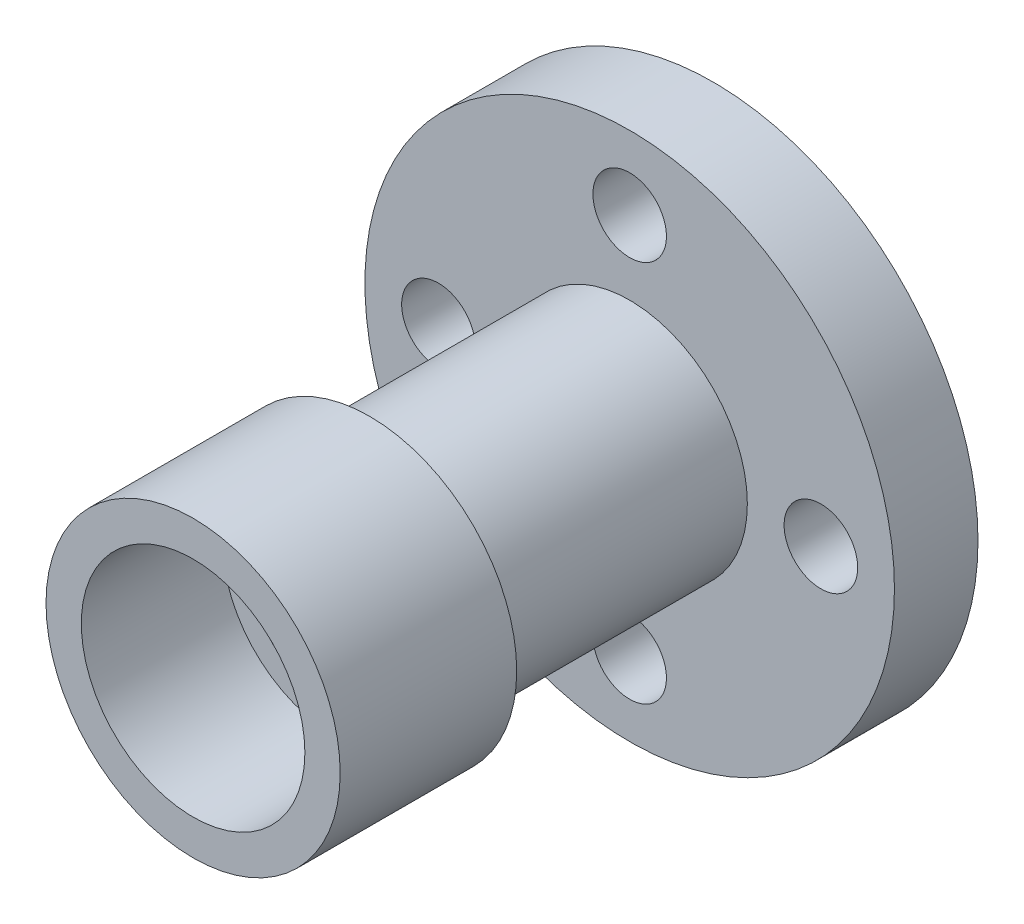
ISO-10303-21;
HEADER;
FILE_DESCRIPTION(('STEP AP214'),'2;1');
FILE_NAME('part.step','',(''),(''),'','','');
FILE_SCHEMA(('AUTOMOTIVE_DESIGN { 1 0 10303 214 1 1 1 1 }'));
ENDSEC;
DATA;
#1=APPLICATION_CONTEXT('core data for automotive mechanical design processes');
#2=APPLICATION_PROTOCOL_DEFINITION('international standard','automotive_design',2000,#1);
#3=PRODUCT_CONTEXT('',#1,'mechanical');
#4=PRODUCT('Part','Part','',(#3));
#5=PRODUCT_RELATED_PRODUCT_CATEGORY('part','',(#4));
#6=PRODUCT_DEFINITION_FORMATION('','',#4);
#7=PRODUCT_DEFINITION_CONTEXT('part definition',#1,'design');
#8=PRODUCT_DEFINITION('design','',#6,#7);
#9=PRODUCT_DEFINITION_SHAPE('','',#8);
#10=(LENGTH_UNIT() NAMED_UNIT(*) SI_UNIT(.MILLI.,.METRE.));
#11=(NAMED_UNIT(*) PLANE_ANGLE_UNIT() SI_UNIT($,.RADIAN.));
#12=(NAMED_UNIT(*) SI_UNIT($,.STERADIAN.) SOLID_ANGLE_UNIT());
#13=UNCERTAINTY_MEASURE_WITH_UNIT(LENGTH_MEASURE(1.E-05),#10,'distance_accuracy_value','');
#14=(GEOMETRIC_REPRESENTATION_CONTEXT(3) GLOBAL_UNCERTAINTY_ASSIGNED_CONTEXT((#13)) GLOBAL_UNIT_ASSIGNED_CONTEXT((#10,
#11,#12)) REPRESENTATION_CONTEXT('',''));
#15=CARTESIAN_POINT('',(0.,0.,0.));
#16=DIRECTION('',(0.,0.,1.));
#17=DIRECTION('',(1.,0.,0.));
#18=AXIS2_PLACEMENT_3D('',#15,#16,#17);
#19=CARTESIAN_POINT('',(0.,0.,14.2));
#20=DIRECTION('',(0.,0.,-1.));
#21=DIRECTION('',(-1.,0.,0.));
#22=AXIS2_PLACEMENT_3D('',#19,#20,#21);
#23=CYLINDRICAL_SURFACE('',#22,45.);
#24=CARTESIAN_POINT('',(0.,0.,14.2));
#25=DIRECTION('',(0.,0.,1.));
#26=DIRECTION('',(1.,0.,0.));
#27=AXIS2_PLACEMENT_3D('',#24,#25,#26);
#28=CIRCLE('',#27,45.);
#29=CARTESIAN_POINT('',(45.,0.,14.2));
#30=VERTEX_POINT('',#29);
#31=EDGE_CURVE('E66',#30,#30,#28,.T.);
#32=ORIENTED_EDGE('',*,*,#31,.F.);
#33=EDGE_LOOP('',(#32));
#34=FACE_BOUND('',#33,.T.);
#35=CARTESIAN_POINT('',(0.,0.,0.));
#36=DIRECTION('',(0.,0.,1.));
#37=DIRECTION('',(1.,0.,0.));
#38=AXIS2_PLACEMENT_3D('',#35,#36,#37);
#39=CIRCLE('',#38,45.);
#40=CARTESIAN_POINT('',(45.,0.,0.));
#41=VERTEX_POINT('',#40);
#42=EDGE_CURVE('E69',#41,#41,#39,.T.);
#43=ORIENTED_EDGE('',*,*,#42,.T.);
#44=EDGE_LOOP('',(#43));
#45=FACE_BOUND('',#44,.T.);
#46=ADVANCED_FACE('F47',(#34,#45),#23,.T.);
#47=CARTESIAN_POINT('',(0.,0.,14.2));
#48=DIRECTION('',(0.,0.,1.));
#49=DIRECTION('',(1.,0.,0.));
#50=AXIS2_PLACEMENT_3D('',#47,#48,#49);
#51=PLANE('',#50);
#52=CARTESIAN_POINT('',(0.,32.5,14.2));
#53=DIRECTION('',(0.,0.,1.));
#54=DIRECTION('',(1.,0.,0.));
#55=AXIS2_PLACEMENT_3D('',#52,#53,#54);
#56=CIRCLE('',#55,6.25);
#57=CARTESIAN_POINT('',(6.25,32.5,14.2));
#58=VERTEX_POINT('',#57);
#59=EDGE_CURVE('E125',#58,#58,#56,.T.);
#60=ORIENTED_EDGE('',*,*,#59,.F.);
#61=EDGE_LOOP('',(#60));
#62=FACE_BOUND('',#61,.T.);
#63=CARTESIAN_POINT('',(32.5,-1.13473143512402E-13,14.2));
#64=DIRECTION('',(0.,0.,1.));
#65=DIRECTION('',(1.,0.,0.));
#66=AXIS2_PLACEMENT_3D('',#63,#64,#65);
#67=CIRCLE('',#66,6.25);
#68=CARTESIAN_POINT('',(38.75,-1.13473143512402E-13,14.2));
#69=VERTEX_POINT('',#68);
#70=EDGE_CURVE('E121',#69,#69,#67,.T.);
#71=ORIENTED_EDGE('',*,*,#70,.F.);
#72=EDGE_LOOP('',(#71));
#73=FACE_BOUND('',#72,.T.);
#74=CARTESIAN_POINT('',(-2.26946287024804E-13,-32.5,14.2));
#75=DIRECTION('',(0.,0.,1.));
#76=DIRECTION('',(1.,0.,0.));
#77=AXIS2_PLACEMENT_3D('',#74,#75,#76);
#78=CIRCLE('',#77,6.25);
#79=CARTESIAN_POINT('',(6.24999999999977,-32.5,14.2));
#80=VERTEX_POINT('',#79);
#81=EDGE_CURVE('E113',#80,#80,#78,.T.);
#82=ORIENTED_EDGE('',*,*,#81,.F.);
#83=EDGE_LOOP('',(#82));
#84=FACE_BOUND('',#83,.T.);
#85=CARTESIAN_POINT('',(-32.5,3.40419430537206E-13,14.2));
#86=DIRECTION('',(0.,0.,1.));
#87=DIRECTION('',(1.,0.,0.));
#88=AXIS2_PLACEMENT_3D('',#85,#86,#87);
#89=CIRCLE('',#88,6.25);
#90=CARTESIAN_POINT('',(-26.25,3.40419430537206E-13,14.2));
#91=VERTEX_POINT('',#90);
#92=EDGE_CURVE('E105',#91,#91,#89,.T.);
#93=ORIENTED_EDGE('',*,*,#92,.F.);
#94=EDGE_LOOP('',(#93));
#95=FACE_BOUND('',#94,.T.);
#96=CARTESIAN_POINT('',(0.,0.,14.2));
#97=DIRECTION('',(0.,0.,1.));
#98=DIRECTION('',(1.,0.,0.));
#99=AXIS2_PLACEMENT_3D('',#96,#97,#98);
#100=CIRCLE('',#99,20.);
#101=CARTESIAN_POINT('',(20.,0.,14.2));
#102=VERTEX_POINT('',#101);
#103=EDGE_CURVE('E61',#102,#102,#100,.T.);
#104=ORIENTED_EDGE('',*,*,#103,.F.);
#105=EDGE_LOOP('',(#104));
#106=FACE_BOUND('',#105,.T.);
#107=ORIENTED_EDGE('',*,*,#31,.T.);
#108=EDGE_LOOP('',(#107));
#109=FACE_BOUND('',#108,.T.);
#110=ADVANCED_FACE('F143',(#62,#73,#84,#95,#106,#109),#51,.T.);
#111=CARTESIAN_POINT('',(0.,0.,0.));
#112=DIRECTION('',(0.,0.,1.));
#113=DIRECTION('',(1.,0.,0.));
#114=AXIS2_PLACEMENT_3D('',#111,#112,#113);
#115=PLANE('',#114);
#116=CARTESIAN_POINT('',(0.,32.5,0.));
#117=DIRECTION('',(0.,0.,1.));
#118=DIRECTION('',(1.,0.,0.));
#119=AXIS2_PLACEMENT_3D('',#116,#117,#118);
#120=CIRCLE('',#119,6.25);
#121=CARTESIAN_POINT('',(6.25,32.5,0.));
#122=VERTEX_POINT('',#121);
#123=EDGE_CURVE('E100',#122,#122,#120,.T.);
#124=ORIENTED_EDGE('',*,*,#123,.T.);
#125=EDGE_LOOP('',(#124));
#126=FACE_BOUND('',#125,.T.);
#127=CARTESIAN_POINT('',(32.5,-1.13473143512402E-13,0.));
#128=DIRECTION('',(0.,0.,1.));
#129=DIRECTION('',(1.,0.,0.));
#130=AXIS2_PLACEMENT_3D('',#127,#128,#129);
#131=CIRCLE('',#130,6.25);
#132=CARTESIAN_POINT('',(38.75,-1.13473143512402E-13,0.));
#133=VERTEX_POINT('',#132);
#134=EDGE_CURVE('E117',#133,#133,#131,.T.);
#135=ORIENTED_EDGE('',*,*,#134,.T.);
#136=EDGE_LOOP('',(#135));
#137=FACE_BOUND('',#136,.T.);
#138=CARTESIAN_POINT('',(-2.26946287024804E-13,-32.5,0.));
#139=DIRECTION('',(0.,0.,1.));
#140=DIRECTION('',(1.,0.,0.));
#141=AXIS2_PLACEMENT_3D('',#138,#139,#140);
#142=CIRCLE('',#141,6.25);
#143=CARTESIAN_POINT('',(6.24999999999977,-32.5,0.));
#144=VERTEX_POINT('',#143);
#145=EDGE_CURVE('E109',#144,#144,#142,.T.);
#146=ORIENTED_EDGE('',*,*,#145,.T.);
#147=EDGE_LOOP('',(#146));
#148=FACE_BOUND('',#147,.T.);
#149=CARTESIAN_POINT('',(-32.5,3.40419430537206E-13,0.));
#150=DIRECTION('',(0.,0.,1.));
#151=DIRECTION('',(1.,0.,0.));
#152=AXIS2_PLACEMENT_3D('',#149,#150,#151);
#153=CIRCLE('',#152,6.25);
#154=CARTESIAN_POINT('',(-26.25,3.40419430537206E-13,0.));
#155=VERTEX_POINT('',#154);
#156=EDGE_CURVE('E101',#155,#155,#153,.T.);
#157=ORIENTED_EDGE('',*,*,#156,.T.);
#158=EDGE_LOOP('',(#157));
#159=FACE_BOUND('',#158,.T.);
#160=CARTESIAN_POINT('',(0.,0.,0.));
#161=DIRECTION('',(0.,0.,1.));
#162=DIRECTION('',(1.,0.,0.));
#163=AXIS2_PLACEMENT_3D('',#160,#161,#162);
#164=CIRCLE('',#163,18.);
#165=CARTESIAN_POINT('',(18.,0.,0.));
#166=VERTEX_POINT('',#165);
#167=EDGE_CURVE('E56',#166,#166,#164,.T.);
#168=ORIENTED_EDGE('',*,*,#167,.T.);
#169=EDGE_LOOP('',(#168));
#170=FACE_BOUND('',#169,.T.);
#171=ORIENTED_EDGE('',*,*,#42,.F.);
#172=EDGE_LOOP('',(#171));
#173=FACE_BOUND('',#172,.T.);
#174=ADVANCED_FACE('F133',(#126,#137,#148,#159,#170,#173),#115,.F.);
#175=CARTESIAN_POINT('',(0.,0.,58.4));
#176=DIRECTION('',(0.,0.,-1.));
#177=DIRECTION('',(-1.,0.,0.));
#178=AXIS2_PLACEMENT_3D('',#175,#176,#177);
#179=CYLINDRICAL_SURFACE('',#178,20.);
#180=CARTESIAN_POINT('',(0.,0.,58.4));
#181=DIRECTION('',(0.,0.,1.));
#182=DIRECTION('',(1.,0.,0.));
#183=AXIS2_PLACEMENT_3D('',#180,#181,#182);
#184=CIRCLE('',#183,20.);
#185=CARTESIAN_POINT('',(20.,0.,58.4));
#186=VERTEX_POINT('',#185);
#187=EDGE_CURVE('E73',#186,#186,#184,.T.);
#188=ORIENTED_EDGE('',*,*,#187,.F.);
#189=EDGE_LOOP('',(#188));
#190=FACE_BOUND('',#189,.T.);
#191=ORIENTED_EDGE('',*,*,#103,.T.);
#192=EDGE_LOOP('',(#191));
#193=FACE_BOUND('',#192,.T.);
#194=ADVANCED_FACE('F162',(#190,#193),#179,.T.);
#195=CARTESIAN_POINT('',(0.,0.,-26.8));
#196=DIRECTION('',(0.,0.,1.));
#197=DIRECTION('',(1.,0.,0.));
#198=AXIS2_PLACEMENT_3D('',#195,#196,#197);
#199=CYLINDRICAL_SURFACE('',#198,15.);
#200=CARTESIAN_POINT('',(0.,0.,3.50000000000005));
#201=DIRECTION('',(0.,0.,1.));
#202=DIRECTION('',(1.,0.,0.));
#203=AXIS2_PLACEMENT_3D('',#200,#201,#202);
#204=CIRCLE('',#203,15.);
#205=CARTESIAN_POINT('',(15.,0.,3.50000000000005));
#206=VERTEX_POINT('',#205);
#207=EDGE_CURVE('E10',#206,#206,#204,.F.);
#208=ORIENTED_EDGE('',*,*,#207,.T.);
#209=EDGE_LOOP('',(#208));
#210=FACE_BOUND('',#209,.T.);
#211=CARTESIAN_POINT('',(0.,0.,64.4));
#212=DIRECTION('',(0.,0.,1.));
#213=DIRECTION('',(1.,0.,0.));
#214=AXIS2_PLACEMENT_3D('',#211,#212,#213);
#215=CIRCLE('',#214,15.);
#216=CARTESIAN_POINT('',(15.,0.,64.4));
#217=VERTEX_POINT('',#216);
#218=EDGE_CURVE('E93',#217,#217,#215,.T.);
#219=ORIENTED_EDGE('',*,*,#218,.T.);
#220=EDGE_LOOP('',(#219));
#221=FACE_BOUND('',#220,.T.);
#222=ADVANCED_FACE('F168',(#210,#221),#199,.F.);
#223=CARTESIAN_POINT('',(0.,0.,58.4));
#224=DIRECTION('',(0.,0.,1.));
#225=DIRECTION('',(1.,0.,0.));
#226=AXIS2_PLACEMENT_3D('',#223,#224,#225);
#227=PLANE('',#226);
#228=ORIENTED_EDGE('',*,*,#187,.T.);
#229=EDGE_LOOP('',(#228));
#230=FACE_BOUND('',#229,.T.);
#231=CARTESIAN_POINT('',(0.,0.,58.4));
#232=DIRECTION('',(0.,0.,1.));
#233=DIRECTION('',(1.,0.,0.));
#234=AXIS2_PLACEMENT_3D('',#231,#232,#233);
#235=CIRCLE('',#234,25.);
#236=CARTESIAN_POINT('',(25.,0.,58.4));
#237=VERTEX_POINT('',#236);
#238=EDGE_CURVE('E81',#237,#237,#235,.T.);
#239=ORIENTED_EDGE('',*,*,#238,.F.);
#240=EDGE_LOOP('',(#239));
#241=FACE_BOUND('',#240,.T.);
#242=ADVANCED_FACE('F174',(#230,#241),#227,.F.);
#243=CARTESIAN_POINT('',(0.,0.,88.4));
#244=DIRECTION('',(0.,0.,1.));
#245=DIRECTION('',(1.,0.,0.));
#246=AXIS2_PLACEMENT_3D('',#243,#244,#245);
#247=PLANE('',#246);
#248=CARTESIAN_POINT('',(0.,0.,88.4));
#249=DIRECTION('',(0.,0.,1.));
#250=DIRECTION('',(1.,0.,0.));
#251=AXIS2_PLACEMENT_3D('',#248,#249,#250);
#252=CIRCLE('',#251,19.);
#253=CARTESIAN_POINT('',(19.,0.,88.4));
#254=VERTEX_POINT('',#253);
#255=EDGE_CURVE('E89',#254,#254,#252,.T.);
#256=ORIENTED_EDGE('',*,*,#255,.F.);
#257=EDGE_LOOP('',(#256));
#258=FACE_BOUND('',#257,.T.);
#259=CARTESIAN_POINT('',(0.,0.,88.4));
#260=DIRECTION('',(0.,0.,1.));
#261=DIRECTION('',(1.,0.,0.));
#262=AXIS2_PLACEMENT_3D('',#259,#260,#261);
#263=CIRCLE('',#262,25.);
#264=CARTESIAN_POINT('',(25.,0.,88.4));
#265=VERTEX_POINT('',#264);
#266=EDGE_CURVE('E80',#265,#265,#263,.T.);
#267=ORIENTED_EDGE('',*,*,#266,.T.);
#268=EDGE_LOOP('',(#267));
#269=FACE_BOUND('',#268,.T.);
#270=ADVANCED_FACE('F179',(#258,#269),#247,.T.);
#271=CARTESIAN_POINT('',(0.,0.,88.4));
#272=DIRECTION('',(0.,0.,-1.));
#273=DIRECTION('',(-1.,0.,0.));
#274=AXIS2_PLACEMENT_3D('',#271,#272,#273);
#275=CYLINDRICAL_SURFACE('',#274,25.);
#276=ORIENTED_EDGE('',*,*,#266,.F.);
#277=EDGE_LOOP('',(#276));
#278=FACE_BOUND('',#277,.T.);
#279=ORIENTED_EDGE('',*,*,#238,.T.);
#280=EDGE_LOOP('',(#279));
#281=FACE_BOUND('',#280,.T.);
#282=ADVANCED_FACE('F175',(#278,#281),#275,.T.);
#283=CARTESIAN_POINT('',(0.,0.,64.4));
#284=DIRECTION('',(0.,0.,1.));
#285=DIRECTION('',(1.,0.,0.));
#286=AXIS2_PLACEMENT_3D('',#283,#284,#285);
#287=CYLINDRICAL_SURFACE('',#286,19.);
#288=CARTESIAN_POINT('',(0.,0.,64.4));
#289=DIRECTION('',(0.,0.,1.));
#290=DIRECTION('',(1.,0.,0.));
#291=AXIS2_PLACEMENT_3D('',#288,#289,#290);
#292=CIRCLE('',#291,19.);
#293=CARTESIAN_POINT('',(19.,0.,64.4));
#294=VERTEX_POINT('',#293);
#295=EDGE_CURVE('E85',#294,#294,#292,.T.);
#296=ORIENTED_EDGE('',*,*,#295,.F.);
#297=EDGE_LOOP('',(#296));
#298=FACE_BOUND('',#297,.T.);
#299=ORIENTED_EDGE('',*,*,#255,.T.);
#300=EDGE_LOOP('',(#299));
#301=FACE_BOUND('',#300,.T.);
#302=ADVANCED_FACE('F178',(#298,#301),#287,.F.);
#303=CARTESIAN_POINT('',(0.,0.,64.4));
#304=DIRECTION('',(0.,0.,1.));
#305=DIRECTION('',(1.,0.,0.));
#306=AXIS2_PLACEMENT_3D('',#303,#304,#305);
#307=PLANE('',#306);
#308=ORIENTED_EDGE('',*,*,#218,.F.);
#309=EDGE_LOOP('',(#308));
#310=FACE_BOUND('',#309,.T.);
#311=ORIENTED_EDGE('',*,*,#295,.T.);
#312=EDGE_LOOP('',(#311));
#313=FACE_BOUND('',#312,.T.);
#314=ADVANCED_FACE('F189',(#310,#313),#307,.T.);
#315=CARTESIAN_POINT('',(0.,0.,0.));
#316=DIRECTION('',(0.,0.,-1.));
#317=DIRECTION('',(-1.,0.,0.));
#318=AXIS2_PLACEMENT_3D('',#315,#316,#317);
#319=CONICAL_SURFACE('',#318,18.,0.708626272127668);
#320=ORIENTED_EDGE('',*,*,#207,.F.);
#321=EDGE_LOOP('',(#320));
#322=FACE_BOUND('',#321,.T.);
#323=ORIENTED_EDGE('',*,*,#167,.F.);
#324=EDGE_LOOP('',(#323));
#325=FACE_BOUND('',#324,.T.);
#326=ADVANCED_FACE('F50',(#322,#325),#319,.F.);
#327=CARTESIAN_POINT('',(-32.5,3.40419430537206E-13,0.));
#328=DIRECTION('',(0.,0.,1.));
#329=DIRECTION('',(1.,0.,0.));
#330=AXIS2_PLACEMENT_3D('',#327,#328,#329);
#331=CYLINDRICAL_SURFACE('',#330,6.25);
#332=ORIENTED_EDGE('',*,*,#156,.F.);
#333=EDGE_LOOP('',(#332));
#334=FACE_BOUND('',#333,.T.);
#335=ORIENTED_EDGE('',*,*,#92,.T.);
#336=EDGE_LOOP('',(#335));
#337=FACE_BOUND('',#336,.T.);
#338=ADVANCED_FACE('F194',(#334,#337),#331,.F.);
#339=CARTESIAN_POINT('',(-2.26946287024804E-13,-32.5,0.));
#340=DIRECTION('',(0.,0.,1.));
#341=DIRECTION('',(1.,0.,0.));
#342=AXIS2_PLACEMENT_3D('',#339,#340,#341);
#343=CYLINDRICAL_SURFACE('',#342,6.25);
#344=ORIENTED_EDGE('',*,*,#145,.F.);
#345=EDGE_LOOP('',(#344));
#346=FACE_BOUND('',#345,.T.);
#347=ORIENTED_EDGE('',*,*,#81,.T.);
#348=EDGE_LOOP('',(#347));
#349=FACE_BOUND('',#348,.T.);
#350=ADVANCED_FACE('F196',(#346,#349),#343,.F.);
#351=CARTESIAN_POINT('',(32.5,-1.13473143512402E-13,0.));
#352=DIRECTION('',(0.,0.,1.));
#353=DIRECTION('',(1.,0.,0.));
#354=AXIS2_PLACEMENT_3D('',#351,#352,#353);
#355=CYLINDRICAL_SURFACE('',#354,6.25);
#356=ORIENTED_EDGE('',*,*,#134,.F.);
#357=EDGE_LOOP('',(#356));
#358=FACE_BOUND('',#357,.T.);
#359=ORIENTED_EDGE('',*,*,#70,.T.);
#360=EDGE_LOOP('',(#359));
#361=FACE_BOUND('',#360,.T.);
#362=ADVANCED_FACE('F139',(#358,#361),#355,.F.);
#363=CARTESIAN_POINT('',(0.,32.5,0.));
#364=DIRECTION('',(0.,0.,1.));
#365=DIRECTION('',(1.,0.,0.));
#366=AXIS2_PLACEMENT_3D('',#363,#364,#365);
#367=CYLINDRICAL_SURFACE('',#366,6.25);
#368=ORIENTED_EDGE('',*,*,#123,.F.);
#369=EDGE_LOOP('',(#368));
#370=FACE_BOUND('',#369,.T.);
#371=ORIENTED_EDGE('',*,*,#59,.T.);
#372=EDGE_LOOP('',(#371));
#373=FACE_BOUND('',#372,.T.);
#374=ADVANCED_FACE('F136',(#370,#373),#367,.F.);
#375=CLOSED_SHELL('',(#46,#110,#174,#194,#222,#242,#270,#282,#302,#314,#326,#338,#350,#362,#374));
#376=MANIFOLD_SOLID_BREP('B2',#375);
#377=ADVANCED_BREP_SHAPE_REPRESENTATION('',(#18,#376),#14);
#378=SHAPE_DEFINITION_REPRESENTATION(#9,#377);
ENDSEC;
END-ISO-10303-21;
